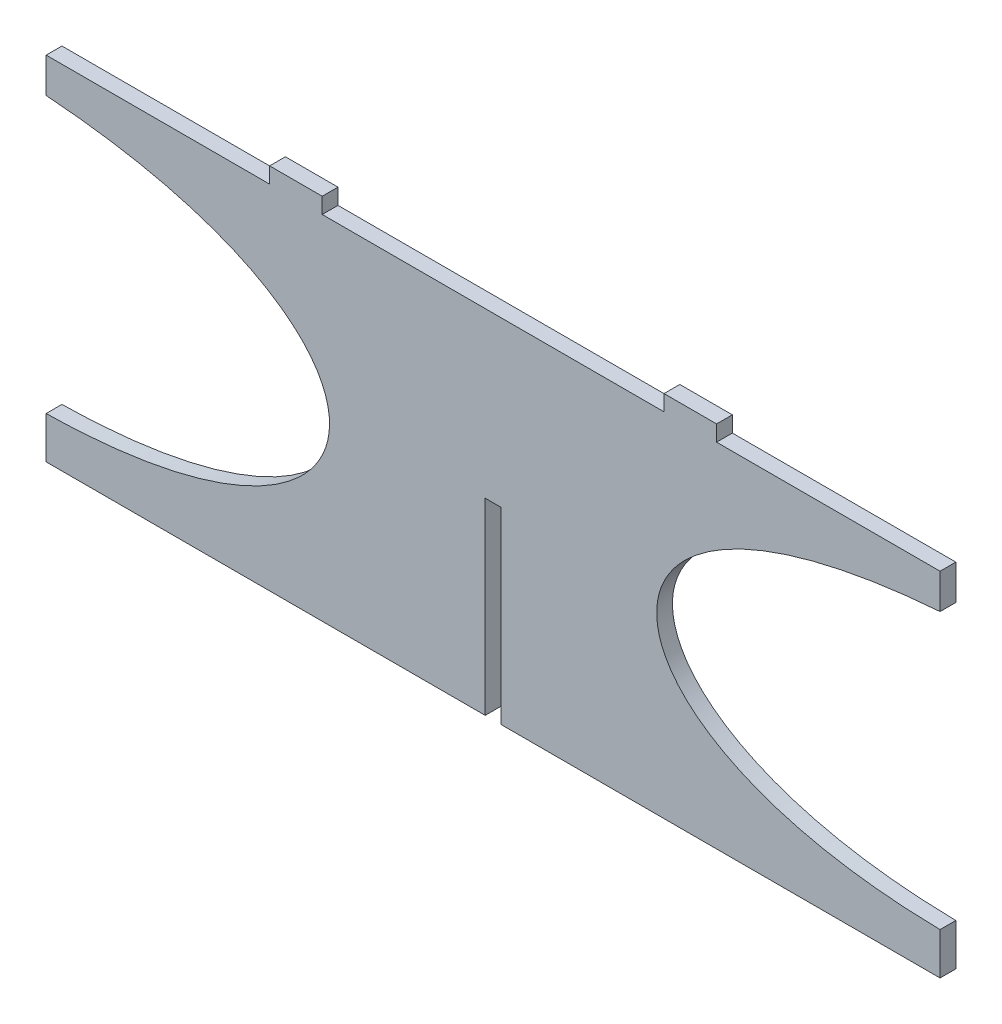
ISO-10303-21;
HEADER;
FILE_DESCRIPTION(('STEP AP214'),'2;1');
FILE_NAME('part.step','',(''),(''),'','','');
FILE_SCHEMA(('AUTOMOTIVE_DESIGN { 1 0 10303 214 1 1 1 1 }'));
ENDSEC;
DATA;
#1=APPLICATION_CONTEXT('core data for automotive mechanical design processes');
#2=APPLICATION_PROTOCOL_DEFINITION('international standard','automotive_design',2000,#1);
#3=PRODUCT_CONTEXT('',#1,'mechanical');
#4=PRODUCT('Part','Part','',(#3));
#5=PRODUCT_RELATED_PRODUCT_CATEGORY('part','',(#4));
#6=PRODUCT_DEFINITION_FORMATION('','',#4);
#7=PRODUCT_DEFINITION_CONTEXT('part definition',#1,'design');
#8=PRODUCT_DEFINITION('design','',#6,#7);
#9=PRODUCT_DEFINITION_SHAPE('','',#8);
#10=(LENGTH_UNIT() NAMED_UNIT(*) SI_UNIT(.MILLI.,.METRE.));
#11=(NAMED_UNIT(*) PLANE_ANGLE_UNIT() SI_UNIT($,.RADIAN.));
#12=(NAMED_UNIT(*) SI_UNIT($,.STERADIAN.) SOLID_ANGLE_UNIT());
#13=UNCERTAINTY_MEASURE_WITH_UNIT(LENGTH_MEASURE(1.E-05),#10,'distance_accuracy_value','');
#14=(GEOMETRIC_REPRESENTATION_CONTEXT(3) GLOBAL_UNCERTAINTY_ASSIGNED_CONTEXT((#13)) GLOBAL_UNIT_ASSIGNED_CONTEXT((#10,
#11,#12)) REPRESENTATION_CONTEXT('',''));
#15=CARTESIAN_POINT('',(0.,0.,0.));
#16=DIRECTION('',(0.,0.,1.));
#17=DIRECTION('',(1.,0.,0.));
#18=AXIS2_PLACEMENT_3D('',#15,#16,#17);
#19=CARTESIAN_POINT('',(-58.8502,-94.0776,2.));
#20=CARTESIAN_POINT('',(-9.0376,-97.7844,2.));
#21=CARTESIAN_POINT('',(-12.8956,-128.2849,2.));
#22=CARTESIAN_POINT('',(-58.8502,-128.9929,2.));
#23=B_SPLINE_CURVE_WITH_KNOTS('',3,(#19,#20,#21,#22),.UNSPECIFIED.,.F.,.F.,(4,4),
(0.0476190476190476,0.0952380952380952),.UNSPECIFIED.);
#24=DIRECTION('',(0.,0.,-1.));
#25=VECTOR('',#24,1.);
#26=SURFACE_OF_LINEAR_EXTRUSION('',#23,#25);
#27=CARTESIAN_POINT('',(-58.8502,-94.0776,0.));
#28=CARTESIAN_POINT('',(-9.0376,-97.7844,0.));
#29=CARTESIAN_POINT('',(-12.8956,-128.2849,0.));
#30=CARTESIAN_POINT('',(-58.8502,-128.9929,0.));
#31=B_SPLINE_CURVE_WITH_KNOTS('',3,(#27,#28,#29,#30),.UNSPECIFIED.,.F.,.F.,(4,4),
(0.0476190476190476,0.0952380952380952),.UNSPECIFIED.);
#32=CARTESIAN_POINT('',(-58.8502,-94.0776,0.));
#33=VERTEX_POINT('',#32);
#34=CARTESIAN_POINT('',(-58.8502,-128.9929,0.));
#35=VERTEX_POINT('',#34);
#36=EDGE_CURVE('E203',#33,#35,#31,.T.);
#37=ORIENTED_EDGE('',*,*,#36,.T.);
#38=DIRECTION('',(0.,0.,-1.));
#39=VECTOR('',#38,1.);
#40=CARTESIAN_POINT('',(-58.8502,-128.9929,2.));
#41=LINE('',#40,#39);
#42=CARTESIAN_POINT('',(-58.8502,-128.9929,2.));
#43=VERTEX_POINT('',#42);
#44=EDGE_CURVE('E11',#43,#35,#41,.T.);
#45=ORIENTED_EDGE('',*,*,#44,.F.);
#46=CARTESIAN_POINT('',(-58.8502,-94.0776,2.));
#47=VERTEX_POINT('',#46);
#48=EDGE_CURVE('E251',#47,#43,#23,.T.);
#49=ORIENTED_EDGE('',*,*,#48,.F.);
#50=DIRECTION('',(0.,0.,-1.));
#51=VECTOR('',#50,1.);
#52=CARTESIAN_POINT('',(-58.8502,-94.0776,2.));
#53=LINE('',#52,#51);
#54=EDGE_CURVE('E199',#47,#33,#53,.T.);
#55=ORIENTED_EDGE('',*,*,#54,.T.);
#56=EDGE_LOOP('',(#37,#45,#49,#55));
#57=FACE_BOUND('',#56,.T.);
#58=ADVANCED_FACE('F34',(#57),#26,.F.);
#59=CARTESIAN_POINT('',(-58.8502,-128.9929,2.));
#60=DIRECTION('',(1.,0.,0.));
#61=DIRECTION('',(0.,0.,-1.));
#62=AXIS2_PLACEMENT_3D('',#59,#60,#61);
#63=PLANE('',#62);
#64=DIRECTION('',(0.,-1.,0.));
#65=VECTOR('',#64,1.);
#66=CARTESIAN_POINT('',(-58.8502,-128.9929,0.));
#67=LINE('',#66,#65);
#68=CARTESIAN_POINT('',(-58.8502,-134.309,0.));
#69=VERTEX_POINT('',#68);
#70=EDGE_CURVE('E208',#35,#69,#67,.T.);
#71=ORIENTED_EDGE('',*,*,#70,.T.);
#72=DIRECTION('',(0.,0.,-1.));
#73=VECTOR('',#72,1.);
#74=CARTESIAN_POINT('',(-58.8502,-134.309,2.));
#75=LINE('',#74,#73);
#76=CARTESIAN_POINT('',(-58.8502,-134.309,2.));
#77=VERTEX_POINT('',#76);
#78=EDGE_CURVE('E43',#77,#69,#75,.T.);
#79=ORIENTED_EDGE('',*,*,#78,.F.);
#80=DIRECTION('',(0.,-1.,0.));
#81=VECTOR('',#80,1.);
#82=CARTESIAN_POINT('',(-58.8502,-128.9929,2.));
#83=LINE('',#82,#81);
#84=EDGE_CURVE('E130',#43,#77,#83,.T.);
#85=ORIENTED_EDGE('',*,*,#84,.F.);
#86=ORIENTED_EDGE('',*,*,#44,.T.);
#87=EDGE_LOOP('',(#71,#79,#85,#86));
#88=FACE_BOUND('',#87,.T.);
#89=ADVANCED_FACE('F365',(#88),#63,.F.);
#90=CARTESIAN_POINT('',(-58.8502,-134.309,2.));
#91=DIRECTION('',(0.,1.,0.));
#92=DIRECTION('',(0.,0.,1.));
#93=AXIS2_PLACEMENT_3D('',#90,#91,#92);
#94=PLANE('',#93);
#95=DIRECTION('',(1.,0.,0.));
#96=VECTOR('',#95,1.);
#97=CARTESIAN_POINT('',(-58.8502,-134.309,0.));
#98=LINE('',#97,#96);
#99=CARTESIAN_POINT('',(-3.1835,-134.309,0.));
#100=VERTEX_POINT('',#99);
#101=EDGE_CURVE('E213',#69,#100,#98,.T.);
#102=ORIENTED_EDGE('',*,*,#101,.T.);
#103=DIRECTION('',(0.,0.,-1.));
#104=VECTOR('',#103,1.);
#105=CARTESIAN_POINT('',(-3.1835,-134.309,2.));
#106=LINE('',#105,#104);
#107=CARTESIAN_POINT('',(-3.1835,-134.309,2.));
#108=VERTEX_POINT('',#107);
#109=EDGE_CURVE('E294',#108,#100,#106,.T.);
#110=ORIENTED_EDGE('',*,*,#109,.F.);
#111=DIRECTION('',(1.,0.,0.));
#112=VECTOR('',#111,1.);
#113=CARTESIAN_POINT('',(-58.8502,-134.309,2.));
#114=LINE('',#113,#112);
#115=EDGE_CURVE('E302',#77,#108,#114,.T.);
#116=ORIENTED_EDGE('',*,*,#115,.F.);
#117=ORIENTED_EDGE('',*,*,#78,.T.);
#118=EDGE_LOOP('',(#102,#110,#116,#117));
#119=FACE_BOUND('',#118,.T.);
#120=ADVANCED_FACE('F300',(#119),#94,.F.);
#121=CARTESIAN_POINT('',(-3.1835,-134.309,2.));
#122=DIRECTION('',(-1.,0.,0.));
#123=DIRECTION('',(0.,0.,1.));
#124=AXIS2_PLACEMENT_3D('',#121,#122,#123);
#125=PLANE('',#124);
#126=DIRECTION('',(0.,1.,0.));
#127=VECTOR('',#126,1.);
#128=CARTESIAN_POINT('',(-3.1835,-134.309,0.));
#129=LINE('',#128,#127);
#130=CARTESIAN_POINT('',(-3.1835,-110.4605,0.));
#131=VERTEX_POINT('',#130);
#132=EDGE_CURVE('E215',#100,#131,#129,.T.);
#133=ORIENTED_EDGE('',*,*,#132,.T.);
#134=DIRECTION('',(0.,0.,-1.));
#135=VECTOR('',#134,1.);
#136=CARTESIAN_POINT('',(-3.1835,-110.4605,2.));
#137=LINE('',#136,#135);
#138=CARTESIAN_POINT('',(-3.1835,-110.4605,2.));
#139=VERTEX_POINT('',#138);
#140=EDGE_CURVE('E291',#139,#131,#137,.T.);
#141=ORIENTED_EDGE('',*,*,#140,.F.);
#142=DIRECTION('',(0.,1.,0.));
#143=VECTOR('',#142,1.);
#144=CARTESIAN_POINT('',(-3.1835,-134.309,2.));
#145=LINE('',#144,#143);
#146=EDGE_CURVE('E320',#108,#139,#145,.T.);
#147=ORIENTED_EDGE('',*,*,#146,.F.);
#148=ORIENTED_EDGE('',*,*,#109,.T.);
#149=EDGE_LOOP('',(#133,#141,#147,#148));
#150=FACE_BOUND('',#149,.T.);
#151=ADVANCED_FACE('F311',(#150),#125,.F.);
#152=CARTESIAN_POINT('',(-3.1835,-110.4605,2.));
#153=DIRECTION('',(0.,1.,0.));
#154=DIRECTION('',(0.,0.,1.));
#155=AXIS2_PLACEMENT_3D('',#152,#153,#154);
#156=PLANE('',#155);
#157=DIRECTION('',(1.,0.,0.));
#158=VECTOR('',#157,1.);
#159=CARTESIAN_POINT('',(-3.1835,-110.4605,0.));
#160=LINE('',#159,#158);
#161=CARTESIAN_POINT('',(-1.1835,-110.4605,0.));
#162=VERTEX_POINT('',#161);
#163=EDGE_CURVE('E217',#131,#162,#160,.T.);
#164=ORIENTED_EDGE('',*,*,#163,.T.);
#165=DIRECTION('',(0.,0.,-1.));
#166=VECTOR('',#165,1.);
#167=CARTESIAN_POINT('',(-1.1835,-110.4605,2.));
#168=LINE('',#167,#166);
#169=CARTESIAN_POINT('',(-1.1835,-110.4605,2.));
#170=VERTEX_POINT('',#169);
#171=EDGE_CURVE('E288',#170,#162,#168,.T.);
#172=ORIENTED_EDGE('',*,*,#171,.F.);
#173=DIRECTION('',(1.,0.,0.));
#174=VECTOR('',#173,1.);
#175=CARTESIAN_POINT('',(-3.1835,-110.4605,2.));
#176=LINE('',#175,#174);
#177=EDGE_CURVE('E317',#139,#170,#176,.T.);
#178=ORIENTED_EDGE('',*,*,#177,.F.);
#179=ORIENTED_EDGE('',*,*,#140,.T.);
#180=EDGE_LOOP('',(#164,#172,#178,#179));
#181=FACE_BOUND('',#180,.T.);
#182=ADVANCED_FACE('F315',(#181),#156,.F.);
#183=CARTESIAN_POINT('',(-1.1835,-110.4605,2.));
#184=DIRECTION('',(1.,0.,0.));
#185=DIRECTION('',(0.,0.,-1.));
#186=AXIS2_PLACEMENT_3D('',#183,#184,#185);
#187=PLANE('',#186);
#188=DIRECTION('',(0.,-1.,0.));
#189=VECTOR('',#188,1.);
#190=CARTESIAN_POINT('',(-1.1835,-110.4605,0.));
#191=LINE('',#190,#189);
#192=CARTESIAN_POINT('',(-1.1835,-134.309,0.));
#193=VERTEX_POINT('',#192);
#194=EDGE_CURVE('E219',#162,#193,#191,.T.);
#195=ORIENTED_EDGE('',*,*,#194,.T.);
#196=DIRECTION('',(0.,0.,-1.));
#197=VECTOR('',#196,1.);
#198=CARTESIAN_POINT('',(-1.1835,-134.309,2.));
#199=LINE('',#198,#197);
#200=CARTESIAN_POINT('',(-1.1835,-134.309,2.));
#201=VERTEX_POINT('',#200);
#202=EDGE_CURVE('E285',#201,#193,#199,.T.);
#203=ORIENTED_EDGE('',*,*,#202,.F.);
#204=DIRECTION('',(0.,-1.,0.));
#205=VECTOR('',#204,1.);
#206=CARTESIAN_POINT('',(-1.1835,-110.4605,2.));
#207=LINE('',#206,#205);
#208=EDGE_CURVE('E319',#170,#201,#207,.T.);
#209=ORIENTED_EDGE('',*,*,#208,.F.);
#210=ORIENTED_EDGE('',*,*,#171,.T.);
#211=EDGE_LOOP('',(#195,#203,#209,#210));
#212=FACE_BOUND('',#211,.T.);
#213=ADVANCED_FACE('F355',(#212),#187,.F.);
#214=CARTESIAN_POINT('',(-1.1835,-134.309,2.));
#215=DIRECTION('',(0.,1.,0.));
#216=DIRECTION('',(0.,0.,1.));
#217=AXIS2_PLACEMENT_3D('',#214,#215,#216);
#218=PLANE('',#217);
#219=DIRECTION('',(1.,0.,0.));
#220=VECTOR('',#219,1.);
#221=CARTESIAN_POINT('',(-1.1835,-134.309,0.));
#222=LINE('',#221,#220);
#223=CARTESIAN_POINT('',(54.4831,-134.309,0.));
#224=VERTEX_POINT('',#223);
#225=EDGE_CURVE('E221',#193,#224,#222,.T.);
#226=ORIENTED_EDGE('',*,*,#225,.T.);
#227=DIRECTION('',(0.,0.,-1.));
#228=VECTOR('',#227,1.);
#229=CARTESIAN_POINT('',(54.4831,-134.309,2.));
#230=LINE('',#229,#228);
#231=CARTESIAN_POINT('',(54.4831,-134.309,2.));
#232=VERTEX_POINT('',#231);
#233=EDGE_CURVE('E282',#232,#224,#230,.T.);
#234=ORIENTED_EDGE('',*,*,#233,.F.);
#235=DIRECTION('',(1.,0.,0.));
#236=VECTOR('',#235,1.);
#237=CARTESIAN_POINT('',(-1.1835,-134.309,2.));
#238=LINE('',#237,#236);
#239=EDGE_CURVE('E322',#201,#232,#238,.T.);
#240=ORIENTED_EDGE('',*,*,#239,.F.);
#241=ORIENTED_EDGE('',*,*,#202,.T.);
#242=EDGE_LOOP('',(#226,#234,#240,#241));
#243=FACE_BOUND('',#242,.T.);
#244=ADVANCED_FACE('F351',(#243),#218,.F.);
#245=CARTESIAN_POINT('',(54.4831,-134.309,2.));
#246=DIRECTION('',(-1.,0.,0.));
#247=DIRECTION('',(0.,0.,1.));
#248=AXIS2_PLACEMENT_3D('',#245,#246,#247);
#249=PLANE('',#248);
#250=DIRECTION('',(0.,1.,0.));
#251=VECTOR('',#250,1.);
#252=CARTESIAN_POINT('',(54.4831,-134.309,0.));
#253=LINE('',#252,#251);
#254=CARTESIAN_POINT('',(54.4831,-128.9929,0.));
#255=VERTEX_POINT('',#254);
#256=EDGE_CURVE('E223',#224,#255,#253,.T.);
#257=ORIENTED_EDGE('',*,*,#256,.T.);
#258=DIRECTION('',(0.,0.,-1.));
#259=VECTOR('',#258,1.);
#260=CARTESIAN_POINT('',(54.4831,-128.9929,2.));
#261=LINE('',#260,#259);
#262=CARTESIAN_POINT('',(54.4831,-128.9929,2.));
#263=VERTEX_POINT('',#262);
#264=EDGE_CURVE('E279',#263,#255,#261,.T.);
#265=ORIENTED_EDGE('',*,*,#264,.F.);
#266=DIRECTION('',(0.,1.,0.));
#267=VECTOR('',#266,1.);
#268=CARTESIAN_POINT('',(54.4831,-134.309,2.));
#269=LINE('',#268,#267);
#270=EDGE_CURVE('E328',#232,#263,#269,.T.);
#271=ORIENTED_EDGE('',*,*,#270,.F.);
#272=ORIENTED_EDGE('',*,*,#233,.T.);
#273=EDGE_LOOP('',(#257,#265,#271,#272));
#274=FACE_BOUND('',#273,.T.);
#275=ADVANCED_FACE('F346',(#274),#249,.F.);
#276=CARTESIAN_POINT('',(54.4831,-128.9929,2.));
#277=CARTESIAN_POINT('',(8.5266,-128.2849,2.));
#278=CARTESIAN_POINT('',(4.6696,-97.7845,2.));
#279=CARTESIAN_POINT('',(54.4831,-94.0776,2.));
#280=B_SPLINE_CURVE_WITH_KNOTS('',3,(#276,#277,#278,#279),.UNSPECIFIED.,.F.,.F.,(4,4),
(0.428571428571428,0.476190476190476),.UNSPECIFIED.);
#281=DIRECTION('',(0.,0.,-1.));
#282=VECTOR('',#281,1.);
#283=SURFACE_OF_LINEAR_EXTRUSION('',#280,#282);
#284=CARTESIAN_POINT('',(54.4831,-128.9929,0.));
#285=CARTESIAN_POINT('',(8.5266,-128.2849,0.));
#286=CARTESIAN_POINT('',(4.6696,-97.7845,0.));
#287=CARTESIAN_POINT('',(54.4831,-94.0776,0.));
#288=B_SPLINE_CURVE_WITH_KNOTS('',3,(#284,#285,#286,#287),.UNSPECIFIED.,.F.,.F.,(4,4),
(0.428571428571428,0.476190476190476),.UNSPECIFIED.);
#289=CARTESIAN_POINT('',(54.4831,-94.0776,0.));
#290=VERTEX_POINT('',#289);
#291=EDGE_CURVE('E225',#255,#290,#288,.T.);
#292=ORIENTED_EDGE('',*,*,#291,.T.);
#293=DIRECTION('',(0.,0.,-1.));
#294=VECTOR('',#293,1.);
#295=CARTESIAN_POINT('',(54.4831,-94.0776,2.));
#296=LINE('',#295,#294);
#297=CARTESIAN_POINT('',(54.4831,-94.0776,2.));
#298=VERTEX_POINT('',#297);
#299=EDGE_CURVE('E276',#298,#290,#296,.T.);
#300=ORIENTED_EDGE('',*,*,#299,.F.);
#301=EDGE_CURVE('E330',#263,#298,#280,.T.);
#302=ORIENTED_EDGE('',*,*,#301,.F.);
#303=ORIENTED_EDGE('',*,*,#264,.T.);
#304=EDGE_LOOP('',(#292,#300,#302,#303));
#305=FACE_BOUND('',#304,.T.);
#306=ADVANCED_FACE('F341',(#305),#283,.F.);
#307=CARTESIAN_POINT('',(54.4831,-94.0776,2.));
#308=DIRECTION('',(-1.,0.,0.));
#309=DIRECTION('',(0.,0.,1.));
#310=AXIS2_PLACEMENT_3D('',#307,#308,#309);
#311=PLANE('',#310);
#312=DIRECTION('',(0.,1.,0.));
#313=VECTOR('',#312,1.);
#314=CARTESIAN_POINT('',(54.4831,-94.0776,0.));
#315=LINE('',#314,#313);
#316=CARTESIAN_POINT('',(54.4831,-89.6424,0.));
#317=VERTEX_POINT('',#316);
#318=EDGE_CURVE('E229',#290,#317,#315,.T.);
#319=ORIENTED_EDGE('',*,*,#318,.T.);
#320=DIRECTION('',(0.,0.,-1.));
#321=VECTOR('',#320,1.);
#322=CARTESIAN_POINT('',(54.4831,-89.6424,2.));
#323=LINE('',#322,#321);
#324=CARTESIAN_POINT('',(54.4831,-89.6424,2.));
#325=VERTEX_POINT('',#324);
#326=EDGE_CURVE('E273',#325,#317,#323,.T.);
#327=ORIENTED_EDGE('',*,*,#326,.F.);
#328=DIRECTION('',(0.,1.,0.));
#329=VECTOR('',#328,1.);
#330=CARTESIAN_POINT('',(54.4831,-94.0776,2.));
#331=LINE('',#330,#329);
#332=EDGE_CURVE('E335',#298,#325,#331,.T.);
#333=ORIENTED_EDGE('',*,*,#332,.F.);
#334=ORIENTED_EDGE('',*,*,#299,.T.);
#335=EDGE_LOOP('',(#319,#327,#333,#334));
#336=FACE_BOUND('',#335,.T.);
#337=ADVANCED_FACE('F345',(#336),#311,.F.);
#338=CARTESIAN_POINT('',(54.4831,-89.6424,2.));
#339=DIRECTION('',(0.,-1.,0.));
#340=DIRECTION('',(0.,0.,-1.));
#341=AXIS2_PLACEMENT_3D('',#338,#339,#340);
#342=PLANE('',#341);
#343=DIRECTION('',(-1.,0.,0.));
#344=VECTOR('',#343,1.);
#345=CARTESIAN_POINT('',(54.4831,-89.6424,0.));
#346=LINE('',#345,#344);
#347=CARTESIAN_POINT('',(26.1498,-89.6424,0.));
#348=VERTEX_POINT('',#347);
#349=EDGE_CURVE('E234',#317,#348,#346,.T.);
#350=ORIENTED_EDGE('',*,*,#349,.T.);
#351=DIRECTION('',(0.,0.,-1.));
#352=VECTOR('',#351,1.);
#353=CARTESIAN_POINT('',(26.1498,-89.6424,2.));
#354=LINE('',#353,#352);
#355=CARTESIAN_POINT('',(26.1498,-89.6424,2.));
#356=VERTEX_POINT('',#355);
#357=EDGE_CURVE('E270',#356,#348,#354,.T.);
#358=ORIENTED_EDGE('',*,*,#357,.F.);
#359=DIRECTION('',(-1.,0.,0.));
#360=VECTOR('',#359,1.);
#361=CARTESIAN_POINT('',(54.4831,-89.6424,2.));
#362=LINE('',#361,#360);
#363=EDGE_CURVE('E414',#325,#356,#362,.T.);
#364=ORIENTED_EDGE('',*,*,#363,.F.);
#365=ORIENTED_EDGE('',*,*,#326,.T.);
#366=EDGE_LOOP('',(#350,#358,#364,#365));
#367=FACE_BOUND('',#366,.T.);
#368=ADVANCED_FACE('F411',(#367),#342,.F.);
#369=CARTESIAN_POINT('',(26.1498,-89.6424,2.));
#370=DIRECTION('',(-1.,0.,0.));
#371=DIRECTION('',(0.,0.,1.));
#372=AXIS2_PLACEMENT_3D('',#369,#370,#371);
#373=PLANE('',#372);
#374=DIRECTION('',(0.,1.,0.));
#375=VECTOR('',#374,1.);
#376=CARTESIAN_POINT('',(26.1498,-89.6424,0.));
#377=LINE('',#376,#375);
#378=CARTESIAN_POINT('',(26.1498,-87.6372,0.));
#379=VERTEX_POINT('',#378);
#380=EDGE_CURVE('E236',#348,#379,#377,.T.);
#381=ORIENTED_EDGE('',*,*,#380,.T.);
#382=DIRECTION('',(0.,0.,-1.));
#383=VECTOR('',#382,1.);
#384=CARTESIAN_POINT('',(26.1498,-87.6372,2.));
#385=LINE('',#384,#383);
#386=CARTESIAN_POINT('',(26.1498,-87.6372,2.));
#387=VERTEX_POINT('',#386);
#388=EDGE_CURVE('E267',#387,#379,#385,.T.);
#389=ORIENTED_EDGE('',*,*,#388,.F.);
#390=DIRECTION('',(0.,1.,0.));
#391=VECTOR('',#390,1.);
#392=CARTESIAN_POINT('',(26.1498,-89.6424,2.));
#393=LINE('',#392,#391);
#394=EDGE_CURVE('E405',#356,#387,#393,.T.);
#395=ORIENTED_EDGE('',*,*,#394,.F.);
#396=ORIENTED_EDGE('',*,*,#357,.T.);
#397=EDGE_LOOP('',(#381,#389,#395,#396));
#398=FACE_BOUND('',#397,.T.);
#399=ADVANCED_FACE('F404',(#398),#373,.F.);
#400=CARTESIAN_POINT('',(26.1498,-87.6372,2.));
#401=DIRECTION('',(0.,-1.,0.));
#402=DIRECTION('',(0.,0.,-1.));
#403=AXIS2_PLACEMENT_3D('',#400,#401,#402);
#404=PLANE('',#403);
#405=DIRECTION('',(-1.,0.,0.));
#406=VECTOR('',#405,1.);
#407=CARTESIAN_POINT('',(26.1498,-87.6372,0.));
#408=LINE('',#407,#406);
#409=CARTESIAN_POINT('',(19.4831,-87.6372,0.));
#410=VERTEX_POINT('',#409);
#411=EDGE_CURVE('E238',#379,#410,#408,.T.);
#412=ORIENTED_EDGE('',*,*,#411,.T.);
#413=DIRECTION('',(0.,0.,-1.));
#414=VECTOR('',#413,1.);
#415=CARTESIAN_POINT('',(19.4831,-87.6372,2.));
#416=LINE('',#415,#414);
#417=CARTESIAN_POINT('',(19.4831,-87.6372,2.));
#418=VERTEX_POINT('',#417);
#419=EDGE_CURVE('E264',#418,#410,#416,.T.);
#420=ORIENTED_EDGE('',*,*,#419,.F.);
#421=DIRECTION('',(-1.,0.,0.));
#422=VECTOR('',#421,1.);
#423=CARTESIAN_POINT('',(26.1498,-87.6372,2.));
#424=LINE('',#423,#422);
#425=EDGE_CURVE('E400',#387,#418,#424,.T.);
#426=ORIENTED_EDGE('',*,*,#425,.F.);
#427=ORIENTED_EDGE('',*,*,#388,.T.);
#428=EDGE_LOOP('',(#412,#420,#426,#427));
#429=FACE_BOUND('',#428,.T.);
#430=ADVANCED_FACE('F399',(#429),#404,.F.);
#431=CARTESIAN_POINT('',(19.4831,-87.6372,2.));
#432=DIRECTION('',(1.,0.,0.));
#433=DIRECTION('',(0.,0.,-1.));
#434=AXIS2_PLACEMENT_3D('',#431,#432,#433);
#435=PLANE('',#434);
#436=DIRECTION('',(0.,-1.,0.));
#437=VECTOR('',#436,1.);
#438=CARTESIAN_POINT('',(19.4831,-87.6372,0.));
#439=LINE('',#438,#437);
#440=CARTESIAN_POINT('',(19.4831,-89.6424,0.));
#441=VERTEX_POINT('',#440);
#442=EDGE_CURVE('E240',#410,#441,#439,.T.);
#443=ORIENTED_EDGE('',*,*,#442,.T.);
#444=DIRECTION('',(0.,0.,-1.));
#445=VECTOR('',#444,1.);
#446=CARTESIAN_POINT('',(19.4831,-89.6424,2.));
#447=LINE('',#446,#445);
#448=CARTESIAN_POINT('',(19.4831,-89.6424,2.));
#449=VERTEX_POINT('',#448);
#450=EDGE_CURVE('E261',#449,#441,#447,.T.);
#451=ORIENTED_EDGE('',*,*,#450,.F.);
#452=DIRECTION('',(0.,-1.,0.));
#453=VECTOR('',#452,1.);
#454=CARTESIAN_POINT('',(19.4831,-87.6372,2.));
#455=LINE('',#454,#453);
#456=EDGE_CURVE('E396',#418,#449,#455,.T.);
#457=ORIENTED_EDGE('',*,*,#456,.F.);
#458=ORIENTED_EDGE('',*,*,#419,.T.);
#459=EDGE_LOOP('',(#443,#451,#457,#458));
#460=FACE_BOUND('',#459,.T.);
#461=ADVANCED_FACE('F393',(#460),#435,.F.);
#462=CARTESIAN_POINT('',(19.4831,-89.6424,2.));
#463=DIRECTION('',(0.,-1.,0.));
#464=DIRECTION('',(0.,0.,-1.));
#465=AXIS2_PLACEMENT_3D('',#462,#463,#464);
#466=PLANE('',#465);
#467=DIRECTION('',(-1.,0.,0.));
#468=VECTOR('',#467,1.);
#469=CARTESIAN_POINT('',(19.4831,-89.6424,0.));
#470=LINE('',#469,#468);
#471=CARTESIAN_POINT('',(-23.8502,-89.6424,0.));
#472=VERTEX_POINT('',#471);
#473=EDGE_CURVE('E242',#441,#472,#470,.T.);
#474=ORIENTED_EDGE('',*,*,#473,.T.);
#475=DIRECTION('',(0.,0.,-1.));
#476=VECTOR('',#475,1.);
#477=CARTESIAN_POINT('',(-23.8502,-89.6424,2.));
#478=LINE('',#477,#476);
#479=CARTESIAN_POINT('',(-23.8502,-89.6424,2.));
#480=VERTEX_POINT('',#479);
#481=EDGE_CURVE('E258',#480,#472,#478,.T.);
#482=ORIENTED_EDGE('',*,*,#481,.F.);
#483=DIRECTION('',(-1.,0.,0.));
#484=VECTOR('',#483,1.);
#485=CARTESIAN_POINT('',(19.4831,-89.6424,2.));
#486=LINE('',#485,#484);
#487=EDGE_CURVE('E387',#449,#480,#486,.T.);
#488=ORIENTED_EDGE('',*,*,#487,.F.);
#489=ORIENTED_EDGE('',*,*,#450,.T.);
#490=EDGE_LOOP('',(#474,#482,#488,#489));
#491=FACE_BOUND('',#490,.T.);
#492=ADVANCED_FACE('F386',(#491),#466,.F.);
#493=CARTESIAN_POINT('',(-23.8502,-89.6424,2.));
#494=DIRECTION('',(-1.,0.,0.));
#495=DIRECTION('',(0.,0.,1.));
#496=AXIS2_PLACEMENT_3D('',#493,#494,#495);
#497=PLANE('',#496);
#498=DIRECTION('',(0.,1.,0.));
#499=VECTOR('',#498,1.);
#500=CARTESIAN_POINT('',(-23.8502,-89.6424,0.));
#501=LINE('',#500,#499);
#502=CARTESIAN_POINT('',(-23.8502,-87.6372,0.));
#503=VERTEX_POINT('',#502);
#504=EDGE_CURVE('E244',#472,#503,#501,.T.);
#505=ORIENTED_EDGE('',*,*,#504,.T.);
#506=DIRECTION('',(0.,0.,-1.));
#507=VECTOR('',#506,1.);
#508=CARTESIAN_POINT('',(-23.8502,-87.6372,2.));
#509=LINE('',#508,#507);
#510=CARTESIAN_POINT('',(-23.8502,-87.6372,2.));
#511=VERTEX_POINT('',#510);
#512=EDGE_CURVE('E255',#511,#503,#509,.T.);
#513=ORIENTED_EDGE('',*,*,#512,.F.);
#514=DIRECTION('',(0.,1.,0.));
#515=VECTOR('',#514,1.);
#516=CARTESIAN_POINT('',(-23.8502,-89.6424,2.));
#517=LINE('',#516,#515);
#518=EDGE_CURVE('E382',#480,#511,#517,.T.);
#519=ORIENTED_EDGE('',*,*,#518,.F.);
#520=ORIENTED_EDGE('',*,*,#481,.T.);
#521=EDGE_LOOP('',(#505,#513,#519,#520));
#522=FACE_BOUND('',#521,.T.);
#523=ADVANCED_FACE('F381',(#522),#497,.F.);
#524=CARTESIAN_POINT('',(-23.8502,-87.6372,2.));
#525=DIRECTION('',(0.,-1.,0.));
#526=DIRECTION('',(0.,0.,-1.));
#527=AXIS2_PLACEMENT_3D('',#524,#525,#526);
#528=PLANE('',#527);
#529=DIRECTION('',(-1.,0.,0.));
#530=VECTOR('',#529,1.);
#531=CARTESIAN_POINT('',(-23.8502,-87.6372,0.));
#532=LINE('',#531,#530);
#533=CARTESIAN_POINT('',(-30.5169,-87.6372,0.));
#534=VERTEX_POINT('',#533);
#535=EDGE_CURVE('E246',#503,#534,#532,.T.);
#536=ORIENTED_EDGE('',*,*,#535,.T.);
#537=DIRECTION('',(0.,0.,-1.));
#538=VECTOR('',#537,1.);
#539=CARTESIAN_POINT('',(-30.5169,-87.6372,2.));
#540=LINE('',#539,#538);
#541=CARTESIAN_POINT('',(-30.5169,-87.6372,2.));
#542=VERTEX_POINT('',#541);
#543=EDGE_CURVE('E194',#542,#534,#540,.T.);
#544=ORIENTED_EDGE('',*,*,#543,.F.);
#545=DIRECTION('',(-1.,0.,0.));
#546=VECTOR('',#545,1.);
#547=CARTESIAN_POINT('',(-23.8502,-87.6372,2.));
#548=LINE('',#547,#546);
#549=EDGE_CURVE('E185',#511,#542,#548,.T.);
#550=ORIENTED_EDGE('',*,*,#549,.F.);
#551=ORIENTED_EDGE('',*,*,#512,.T.);
#552=EDGE_LOOP('',(#536,#544,#550,#551));
#553=FACE_BOUND('',#552,.T.);
#554=ADVANCED_FACE('F377',(#553),#528,.F.);
#555=CARTESIAN_POINT('',(-30.5169,-87.6372,2.));
#556=DIRECTION('',(1.,0.,0.));
#557=DIRECTION('',(0.,0.,-1.));
#558=AXIS2_PLACEMENT_3D('',#555,#556,#557);
#559=PLANE('',#558);
#560=DIRECTION('',(0.,-1.,0.));
#561=VECTOR('',#560,1.);
#562=CARTESIAN_POINT('',(-30.5169,-87.6372,0.));
#563=LINE('',#562,#561);
#564=CARTESIAN_POINT('',(-30.5169,-89.6424,0.));
#565=VERTEX_POINT('',#564);
#566=EDGE_CURVE('E193',#534,#565,#563,.T.);
#567=ORIENTED_EDGE('',*,*,#566,.T.);
#568=DIRECTION('',(0.,0.,-1.));
#569=VECTOR('',#568,1.);
#570=CARTESIAN_POINT('',(-30.5169,-89.6424,2.));
#571=LINE('',#570,#569);
#572=CARTESIAN_POINT('',(-30.5169,-89.6424,2.));
#573=VERTEX_POINT('',#572);
#574=EDGE_CURVE('E190',#573,#565,#571,.T.);
#575=ORIENTED_EDGE('',*,*,#574,.F.);
#576=DIRECTION('',(0.,-1.,0.));
#577=VECTOR('',#576,1.);
#578=CARTESIAN_POINT('',(-30.5169,-87.6372,2.));
#579=LINE('',#578,#577);
#580=EDGE_CURVE('E179',#542,#573,#579,.T.);
#581=ORIENTED_EDGE('',*,*,#580,.F.);
#582=ORIENTED_EDGE('',*,*,#543,.T.);
#583=EDGE_LOOP('',(#567,#575,#581,#582));
#584=FACE_BOUND('',#583,.T.);
#585=ADVANCED_FACE('F191',(#584),#559,.F.);
#586=CARTESIAN_POINT('',(-30.5169,-89.6424,2.));
#587=DIRECTION('',(0.,-1.,0.));
#588=DIRECTION('',(0.,0.,-1.));
#589=AXIS2_PLACEMENT_3D('',#586,#587,#588);
#590=PLANE('',#589);
#591=DIRECTION('',(-1.,0.,0.));
#592=VECTOR('',#591,1.);
#593=CARTESIAN_POINT('',(-30.5169,-89.6424,0.));
#594=LINE('',#593,#592);
#595=CARTESIAN_POINT('',(-58.8502,-89.6424,0.));
#596=VERTEX_POINT('',#595);
#597=EDGE_CURVE('E116',#565,#596,#594,.T.);
#598=ORIENTED_EDGE('',*,*,#597,.T.);
#599=DIRECTION('',(0.,0.,-1.));
#600=VECTOR('',#599,1.);
#601=CARTESIAN_POINT('',(-58.8502,-89.6424,2.));
#602=LINE('',#601,#600);
#603=CARTESIAN_POINT('',(-58.8502,-89.6424,2.));
#604=VERTEX_POINT('',#603);
#605=EDGE_CURVE('E195',#604,#596,#602,.T.);
#606=ORIENTED_EDGE('',*,*,#605,.F.);
#607=DIRECTION('',(-1.,0.,0.));
#608=VECTOR('',#607,1.);
#609=CARTESIAN_POINT('',(-30.5169,-89.6424,2.));
#610=LINE('',#609,#608);
#611=EDGE_CURVE('E183',#573,#604,#610,.T.);
#612=ORIENTED_EDGE('',*,*,#611,.F.);
#613=ORIENTED_EDGE('',*,*,#574,.T.);
#614=EDGE_LOOP('',(#598,#606,#612,#613));
#615=FACE_BOUND('',#614,.T.);
#616=ADVANCED_FACE('F197',(#615),#590,.F.);
#617=CARTESIAN_POINT('',(-58.8502,-89.6424,2.));
#618=DIRECTION('',(1.,0.,0.));
#619=DIRECTION('',(0.,0.,-1.));
#620=AXIS2_PLACEMENT_3D('',#617,#618,#619);
#621=PLANE('',#620);
#622=DIRECTION('',(0.,-1.,0.));
#623=VECTOR('',#622,1.);
#624=CARTESIAN_POINT('',(-58.8502,-89.6424,0.));
#625=LINE('',#624,#623);
#626=EDGE_CURVE('E122',#596,#33,#625,.T.);
#627=ORIENTED_EDGE('',*,*,#626,.T.);
#628=ORIENTED_EDGE('',*,*,#54,.F.);
#629=DIRECTION('',(0.,-1.,0.));
#630=VECTOR('',#629,1.);
#631=CARTESIAN_POINT('',(-58.8502,-89.6424,2.));
#632=LINE('',#631,#630);
#633=EDGE_CURVE('E51',#604,#47,#632,.T.);
#634=ORIENTED_EDGE('',*,*,#633,.F.);
#635=ORIENTED_EDGE('',*,*,#605,.T.);
#636=EDGE_LOOP('',(#627,#628,#634,#635));
#637=FACE_BOUND('',#636,.T.);
#638=ADVANCED_FACE('F454',(#637),#621,.F.);
#639=CARTESIAN_POINT('',(-22.9375,-112.6598,2.));
#640=DIRECTION('',(0.,0.,1.));
#641=DIRECTION('',(1.,0.,0.));
#642=AXIS2_PLACEMENT_3D('',#639,#640,#641);
#643=PLANE('',#642);
#644=ORIENTED_EDGE('',*,*,#48,.T.);
#645=ORIENTED_EDGE('',*,*,#84,.T.);
#646=ORIENTED_EDGE('',*,*,#115,.T.);
#647=ORIENTED_EDGE('',*,*,#146,.T.);
#648=ORIENTED_EDGE('',*,*,#177,.T.);
#649=ORIENTED_EDGE('',*,*,#208,.T.);
#650=ORIENTED_EDGE('',*,*,#239,.T.);
#651=ORIENTED_EDGE('',*,*,#270,.T.);
#652=ORIENTED_EDGE('',*,*,#301,.T.);
#653=ORIENTED_EDGE('',*,*,#332,.T.);
#654=ORIENTED_EDGE('',*,*,#363,.T.);
#655=ORIENTED_EDGE('',*,*,#394,.T.);
#656=ORIENTED_EDGE('',*,*,#425,.T.);
#657=ORIENTED_EDGE('',*,*,#456,.T.);
#658=ORIENTED_EDGE('',*,*,#487,.T.);
#659=ORIENTED_EDGE('',*,*,#518,.T.);
#660=ORIENTED_EDGE('',*,*,#549,.T.);
#661=ORIENTED_EDGE('',*,*,#580,.T.);
#662=ORIENTED_EDGE('',*,*,#611,.T.);
#663=ORIENTED_EDGE('',*,*,#633,.T.);
#664=EDGE_LOOP('',(#644,#645,#646,#647,#648,#649,#650,#651,#652,#653,#654,#655,#656,#657,#658,
#659,#660,#661,#662,#663));
#665=FACE_BOUND('',#664,.T.);
#666=ADVANCED_FACE('F181',(#665),#643,.T.);
#667=CARTESIAN_POINT('',(-22.9375,-112.6598,0.));
#668=DIRECTION('',(0.,0.,1.));
#669=DIRECTION('',(1.,0.,0.));
#670=AXIS2_PLACEMENT_3D('',#667,#668,#669);
#671=PLANE('',#670);
#672=ORIENTED_EDGE('',*,*,#36,.F.);
#673=ORIENTED_EDGE('',*,*,#626,.F.);
#674=ORIENTED_EDGE('',*,*,#597,.F.);
#675=ORIENTED_EDGE('',*,*,#566,.F.);
#676=ORIENTED_EDGE('',*,*,#535,.F.);
#677=ORIENTED_EDGE('',*,*,#504,.F.);
#678=ORIENTED_EDGE('',*,*,#473,.F.);
#679=ORIENTED_EDGE('',*,*,#442,.F.);
#680=ORIENTED_EDGE('',*,*,#411,.F.);
#681=ORIENTED_EDGE('',*,*,#380,.F.);
#682=ORIENTED_EDGE('',*,*,#349,.F.);
#683=ORIENTED_EDGE('',*,*,#318,.F.);
#684=ORIENTED_EDGE('',*,*,#291,.F.);
#685=ORIENTED_EDGE('',*,*,#256,.F.);
#686=ORIENTED_EDGE('',*,*,#225,.F.);
#687=ORIENTED_EDGE('',*,*,#194,.F.);
#688=ORIENTED_EDGE('',*,*,#163,.F.);
#689=ORIENTED_EDGE('',*,*,#132,.F.);
#690=ORIENTED_EDGE('',*,*,#101,.F.);
#691=ORIENTED_EDGE('',*,*,#70,.F.);
#692=EDGE_LOOP('',(#672,#673,#674,#675,#676,#677,#678,#679,#680,#681,#682,#683,#684,#685,#686,
#687,#688,#689,#690,#691));
#693=FACE_BOUND('',#692,.T.);
#694=ADVANCED_FACE('F306',(#693),#671,.F.);
#695=CLOSED_SHELL('',(#58,#89,#120,#151,#182,#213,#244,#275,#306,#337,#368,#399,#430,#461,#492,
#523,#554,#585,#616,#638,#666,#694));
#696=MANIFOLD_SOLID_BREP('B2',#695);
#697=ADVANCED_BREP_SHAPE_REPRESENTATION('',(#18,#696),#14);
#698=SHAPE_DEFINITION_REPRESENTATION(#9,#697);
ENDSEC;
END-ISO-10303-21;
